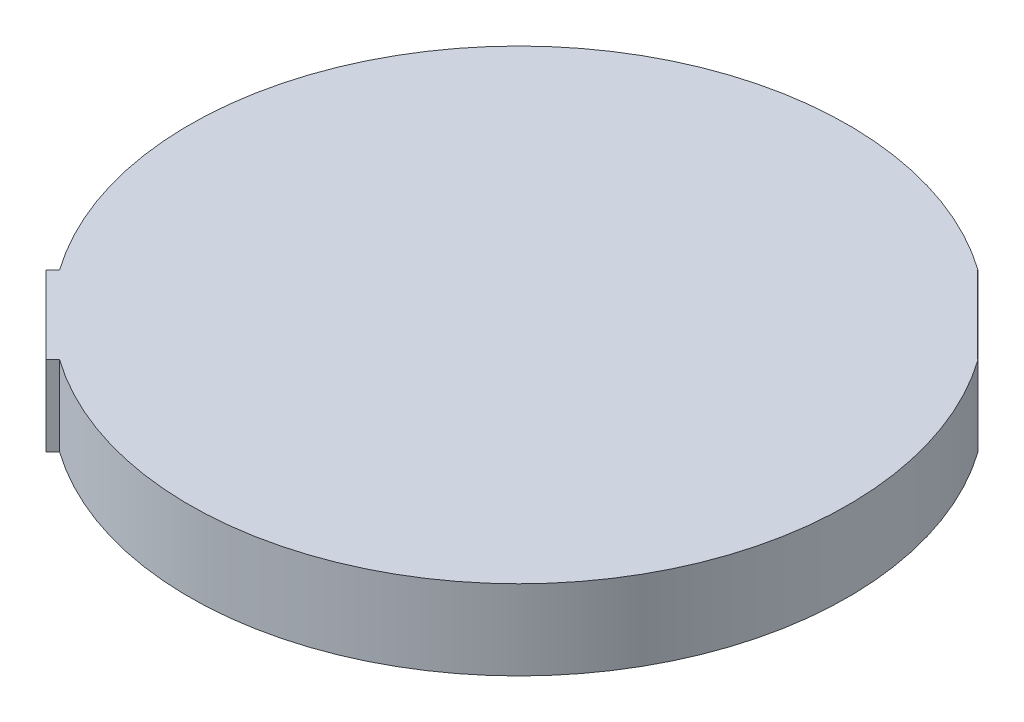
ISO-10303-21;
HEADER;
FILE_DESCRIPTION(('STEP AP214'),'2;1');
FILE_NAME('part.step','',(''),(''),'','','');
FILE_SCHEMA(('AUTOMOTIVE_DESIGN { 1 0 10303 214 1 1 1 1 }'));
ENDSEC;
DATA;
#1=APPLICATION_CONTEXT('core data for automotive mechanical design processes');
#2=APPLICATION_PROTOCOL_DEFINITION('international standard','automotive_design',2000,#1);
#3=PRODUCT_CONTEXT('',#1,'mechanical');
#4=PRODUCT('Part','Part','',(#3));
#5=PRODUCT_RELATED_PRODUCT_CATEGORY('part','',(#4));
#6=PRODUCT_DEFINITION_FORMATION('','',#4);
#7=PRODUCT_DEFINITION_CONTEXT('part definition',#1,'design');
#8=PRODUCT_DEFINITION('design','',#6,#7);
#9=PRODUCT_DEFINITION_SHAPE('','',#8);
#10=(LENGTH_UNIT() NAMED_UNIT(*) SI_UNIT(.MILLI.,.METRE.));
#11=(NAMED_UNIT(*) PLANE_ANGLE_UNIT() SI_UNIT($,.RADIAN.));
#12=(NAMED_UNIT(*) SI_UNIT($,.STERADIAN.) SOLID_ANGLE_UNIT());
#13=UNCERTAINTY_MEASURE_WITH_UNIT(LENGTH_MEASURE(1.E-05),#10,'distance_accuracy_value','');
#14=(GEOMETRIC_REPRESENTATION_CONTEXT(3) GLOBAL_UNCERTAINTY_ASSIGNED_CONTEXT((#13)) GLOBAL_UNIT_ASSIGNED_CONTEXT((#10,
#11,#12)) REPRESENTATION_CONTEXT('',''));
#15=CARTESIAN_POINT('',(0.,0.,0.));
#16=DIRECTION('',(0.,0.,1.));
#17=DIRECTION('',(1.,0.,0.));
#18=AXIS2_PLACEMENT_3D('',#15,#16,#17);
#19=CARTESIAN_POINT('',(0.,80.,0.));
#20=DIRECTION('',(0.,-1.,0.));
#21=DIRECTION('',(0.,0.,-1.));
#22=AXIS2_PLACEMENT_3D('',#19,#20,#21);
#23=CYLINDRICAL_SURFACE('',#22,330.);
#24=CARTESIAN_POINT('',(0.,80.,0.));
#25=DIRECTION('',(0.,1.,0.));
#26=DIRECTION('',(0.,0.,1.));
#27=AXIS2_PLACEMENT_3D('',#24,#25,#26);
#28=CIRCLE('',#27,330.);
#29=CARTESIAN_POINT('',(191.19063433161,80.,-268.972380262131));
#30=VERTEX_POINT('',#29);
#31=CARTESIAN_POINT('',(-268.972380262131,80.0000000000004,191.190634331611));
#32=VERTEX_POINT('',#31);
#33=EDGE_CURVE('E131',#30,#32,#28,.T.);
#34=ORIENTED_EDGE('',*,*,#33,.F.);
#35=DIRECTION('',(0.,-1.,0.));
#36=VECTOR('',#35,1.);
#37=CARTESIAN_POINT('',(191.19063433161,80.,-268.972380262131));
#38=LINE('',#37,#36);
#39=CARTESIAN_POINT('',(191.19063433161,0.,-268.972380262131));
#40=VERTEX_POINT('',#39);
#41=EDGE_CURVE('E154',#30,#40,#38,.T.);
#42=ORIENTED_EDGE('',*,*,#41,.T.);
#43=CARTESIAN_POINT('',(0.,0.,0.));
#44=DIRECTION('',(0.,1.,0.));
#45=DIRECTION('',(0.,0.,1.));
#46=AXIS2_PLACEMENT_3D('',#43,#44,#45);
#47=CIRCLE('',#46,330.);
#48=CARTESIAN_POINT('',(-268.972380262131,1.66533453693773E-13,191.190634331611));
#49=VERTEX_POINT('',#48);
#50=EDGE_CURVE('E122',#40,#49,#47,.T.);
#51=ORIENTED_EDGE('',*,*,#50,.T.);
#52=DIRECTION('',(0.,1.,0.));
#53=VECTOR('',#52,1.);
#54=CARTESIAN_POINT('',(-268.972380262131,-119.615611929521,191.190634331611));
#55=LINE('',#54,#53);
#56=EDGE_CURVE('E144',#49,#32,#55,.T.);
#57=ORIENTED_EDGE('',*,*,#56,.T.);
#58=EDGE_LOOP('',(#34,#42,#51,#57));
#59=FACE_BOUND('',#58,.T.);
#60=ADVANCED_FACE('F38',(#59),#23,.T.);
#61=CARTESIAN_POINT('',(-191.190634331611,2.77555756156289E-13,268.972380262131));
#62=VERTEX_POINT('',#61);
#63=CARTESIAN_POINT('',(268.972380262131,1.11022302462516E-13,-191.190634331611));
#64=VERTEX_POINT('',#63);
#65=EDGE_CURVE('E128',#62,#64,#47,.T.);
#66=ORIENTED_EDGE('',*,*,#65,.T.);
#67=DIRECTION('',(0.,-1.,0.));
#68=VECTOR('',#67,1.);
#69=CARTESIAN_POINT('',(268.972380262131,80.,-191.190634331611));
#70=LINE('',#69,#68);
#71=CARTESIAN_POINT('',(268.972380262131,80.0000000000001,-191.190634331611));
#72=VERTEX_POINT('',#71);
#73=EDGE_CURVE('E158',#64,#72,#70,.F.);
#74=ORIENTED_EDGE('',*,*,#73,.T.);
#75=CARTESIAN_POINT('',(-191.190634331611,80.0000000000002,268.972380262131));
#76=VERTEX_POINT('',#75);
#77=EDGE_CURVE('E61',#76,#72,#28,.T.);
#78=ORIENTED_EDGE('',*,*,#77,.F.);
#79=DIRECTION('',(0.,1.,0.));
#80=VECTOR('',#79,1.);
#81=CARTESIAN_POINT('',(-191.190634331611,-119.615611929521,268.972380262131));
#82=LINE('',#81,#80);
#83=EDGE_CURVE('E147',#62,#76,#82,.T.);
#84=ORIENTED_EDGE('',*,*,#83,.F.);
#85=EDGE_LOOP('',(#66,#74,#78,#84));
#86=FACE_BOUND('',#85,.T.);
#87=ADVANCED_FACE('F40',(#86),#23,.T.);
#88=CARTESIAN_POINT('',(0.,80.,0.));
#89=DIRECTION('',(0.,1.,0.));
#90=DIRECTION('',(0.,0.,1.));
#91=AXIS2_PLACEMENT_3D('',#88,#89,#90);
#92=PLANE('',#91);
#93=DIRECTION('',(-0.707106781186547,0.,0.707106781186548));
#94=VECTOR('',#93,1.);
#95=CARTESIAN_POINT('',(199.404112294606,80.0000000000004,-277.185858225127));
#96=LINE('',#95,#94);
#97=CARTESIAN_POINT('',(190.918830920368,80.,-268.700576850889));
#98=VERTEX_POINT('',#97);
#99=EDGE_CURVE('E116',#30,#98,#96,.T.);
#100=ORIENTED_EDGE('',*,*,#99,.F.);
#101=ORIENTED_EDGE('',*,*,#33,.T.);
#102=DIRECTION('',(-0.707106781186543,0.,0.707106781186554));
#103=VECTOR('',#102,1.);
#104=CARTESIAN_POINT('',(-272.236110756822,80.0000000000001,194.454364826301));
#105=LINE('',#104,#103);
#106=CARTESIAN_POINT('',(-275.771644662754,80.0000000000003,197.989898732234));
#107=VERTEX_POINT('',#106);
#108=EDGE_CURVE('E143',#32,#107,#105,.T.);
#109=ORIENTED_EDGE('',*,*,#108,.T.);
#110=DIRECTION('',(0.707106781186548,0.,0.707106781186549));
#111=VECTOR('',#110,1.);
#112=CARTESIAN_POINT('',(-275.771644662754,80.0000000000003,197.989898732234));
#113=LINE('',#112,#111);
#114=CARTESIAN_POINT('',(-197.989898732234,80.0000000000001,275.771644662753));
#115=VERTEX_POINT('',#114);
#116=EDGE_CURVE('E153',#107,#115,#113,.T.);
#117=ORIENTED_EDGE('',*,*,#116,.T.);
#118=DIRECTION('',(0.707106781186545,0.,-0.707106781186551));
#119=VECTOR('',#118,1.);
#120=CARTESIAN_POINT('',(-194.454364826301,80.,272.23611075682));
#121=LINE('',#120,#119);
#122=EDGE_CURVE('E156',#115,#76,#121,.T.);
#123=ORIENTED_EDGE('',*,*,#122,.T.);
#124=ORIENTED_EDGE('',*,*,#77,.T.);
#125=DIRECTION('',(-0.707106781186547,0.,0.707106781186548));
#126=VECTOR('',#125,1.);
#127=CARTESIAN_POINT('',(277.185858225127,80.0000000000003,-199.404112294607));
#128=LINE('',#127,#126);
#129=CARTESIAN_POINT('',(268.700576850888,79.9999999999997,-190.918830920368));
#130=VERTEX_POINT('',#129);
#131=EDGE_CURVE('E177',#72,#130,#128,.T.);
#132=ORIENTED_EDGE('',*,*,#131,.T.);
#133=DIRECTION('',(-0.707106781186548,0.,-0.707106781186549));
#134=VECTOR('',#133,1.);
#135=CARTESIAN_POINT('',(268.700576850888,79.9999999999997,-190.918830920368));
#136=LINE('',#135,#134);
#137=EDGE_CURVE('E179',#130,#98,#136,.T.);
#138=ORIENTED_EDGE('',*,*,#137,.T.);
#139=EDGE_LOOP('',(#100,#101,#109,#117,#123,#124,#132,#138));
#140=FACE_BOUND('',#139,.T.);
#141=ADVANCED_FACE('F140',(#140),#92,.T.);
#142=CARTESIAN_POINT('',(0.,0.,0.));
#143=DIRECTION('',(0.,1.,0.));
#144=DIRECTION('',(0.,0.,1.));
#145=AXIS2_PLACEMENT_3D('',#142,#143,#144);
#146=PLANE('',#145);
#147=ORIENTED_EDGE('',*,*,#50,.F.);
#148=DIRECTION('',(-0.707106781186548,0.,0.707106781186548));
#149=VECTOR('',#148,1.);
#150=CARTESIAN_POINT('',(-38.8908729652608,0.,-38.8908729652604));
#151=LINE('',#150,#149);
#152=CARTESIAN_POINT('',(190.918830920367,3.33066907387547E-13,-268.700576850889));
#153=VERTEX_POINT('',#152);
#154=EDGE_CURVE('E11',#40,#153,#151,.T.);
#155=ORIENTED_EDGE('',*,*,#154,.T.);
#156=DIRECTION('',(0.707106781186548,0.,0.707106781186549));
#157=VECTOR('',#156,1.);
#158=CARTESIAN_POINT('',(190.918830920367,3.33066907387547E-13,-268.700576850889));
#159=LINE('',#158,#157);
#160=CARTESIAN_POINT('',(268.700576850888,0.,-190.918830920368));
#161=VERTEX_POINT('',#160);
#162=EDGE_CURVE('E104',#153,#161,#159,.T.);
#163=ORIENTED_EDGE('',*,*,#162,.T.);
#164=DIRECTION('',(0.707106781186548,0.,-0.707106781186548));
#165=VECTOR('',#164,1.);
#166=CARTESIAN_POINT('',(38.8908729652597,0.,38.8908729652598));
#167=LINE('',#166,#165);
#168=EDGE_CURVE('E46',#161,#64,#167,.T.);
#169=ORIENTED_EDGE('',*,*,#168,.T.);
#170=ORIENTED_EDGE('',*,*,#65,.F.);
#171=DIRECTION('',(-0.707106781186545,0.,0.707106781186551));
#172=VECTOR('',#171,1.);
#173=CARTESIAN_POINT('',(-194.454364826301,0.,272.23611075682));
#174=LINE('',#173,#172);
#175=CARTESIAN_POINT('',(-197.989898732234,0.,275.771644662753));
#176=VERTEX_POINT('',#175);
#177=EDGE_CURVE('E132',#62,#176,#174,.T.);
#178=ORIENTED_EDGE('',*,*,#177,.T.);
#179=DIRECTION('',(-0.707106781186548,0.,-0.707106781186549));
#180=VECTOR('',#179,1.);
#181=CARTESIAN_POINT('',(-275.771644662754,1.11022302462516E-13,197.989898732233));
#182=LINE('',#181,#180);
#183=CARTESIAN_POINT('',(-275.771644662754,1.11022302462516E-13,197.989898732233));
#184=VERTEX_POINT('',#183);
#185=EDGE_CURVE('E146',#176,#184,#182,.T.);
#186=ORIENTED_EDGE('',*,*,#185,.T.);
#187=DIRECTION('',(0.707106781186543,0.,-0.707106781186554));
#188=VECTOR('',#187,1.);
#189=CARTESIAN_POINT('',(-272.236110756821,0.,194.454364826301));
#190=LINE('',#189,#188);
#191=EDGE_CURVE('E124',#184,#49,#190,.T.);
#192=ORIENTED_EDGE('',*,*,#191,.T.);
#193=EDGE_LOOP('',(#147,#155,#163,#169,#170,#178,#186,#192));
#194=FACE_BOUND('',#193,.T.);
#195=ADVANCED_FACE('F120',(#194),#146,.F.);
#196=CARTESIAN_POINT('',(-194.454364826301,-119.615611929521,272.236110756821));
#197=DIRECTION('',(0.707106781186551,0.,0.707106781186546));
#198=DIRECTION('',(0.707106781186545,0.,-0.707106781186551));
#199=AXIS2_PLACEMENT_3D('',#196,#197,#198);
#200=PLANE('',#199);
#201=ORIENTED_EDGE('',*,*,#177,.F.);
#202=ORIENTED_EDGE('',*,*,#83,.T.);
#203=ORIENTED_EDGE('',*,*,#122,.F.);
#204=DIRECTION('',(0.,1.,0.));
#205=VECTOR('',#204,1.);
#206=CARTESIAN_POINT('',(-197.989898732234,-119.615611929521,275.771644662753));
#207=LINE('',#206,#205);
#208=EDGE_CURVE('E165',#176,#115,#207,.T.);
#209=ORIENTED_EDGE('',*,*,#208,.F.);
#210=EDGE_LOOP('',(#201,#202,#203,#209));
#211=FACE_BOUND('',#210,.T.);
#212=ADVANCED_FACE('F174',(#211),#200,.T.);
#213=CARTESIAN_POINT('',(-275.771644662754,-119.615611929521,197.989898732233));
#214=DIRECTION('',(-0.707106781186547,0.,0.707106781186548));
#215=DIRECTION('',(0.707106781186548,0.,0.707106781186549));
#216=AXIS2_PLACEMENT_3D('',#213,#214,#215);
#217=PLANE('',#216);
#218=ORIENTED_EDGE('',*,*,#185,.F.);
#219=ORIENTED_EDGE('',*,*,#208,.T.);
#220=ORIENTED_EDGE('',*,*,#116,.F.);
#221=DIRECTION('',(0.,1.,0.));
#222=VECTOR('',#221,1.);
#223=CARTESIAN_POINT('',(-275.771644662754,-119.615611929521,197.989898732233));
#224=LINE('',#223,#222);
#225=EDGE_CURVE('E151',#184,#107,#224,.T.);
#226=ORIENTED_EDGE('',*,*,#225,.F.);
#227=EDGE_LOOP('',(#218,#219,#220,#226));
#228=FACE_BOUND('',#227,.T.);
#229=ADVANCED_FACE('F171',(#228),#217,.T.);
#230=CARTESIAN_POINT('',(-272.236110756821,-119.615611929521,194.4543648263));
#231=DIRECTION('',(-0.707106781186554,0.,-0.707106781186543));
#232=DIRECTION('',(-0.707106781186543,0.,0.707106781186554));
#233=AXIS2_PLACEMENT_3D('',#230,#231,#232);
#234=PLANE('',#233);
#235=ORIENTED_EDGE('',*,*,#191,.F.);
#236=ORIENTED_EDGE('',*,*,#225,.T.);
#237=ORIENTED_EDGE('',*,*,#108,.F.);
#238=ORIENTED_EDGE('',*,*,#56,.F.);
#239=EDGE_LOOP('',(#235,#236,#237,#238));
#240=FACE_BOUND('',#239,.T.);
#241=ADVANCED_FACE('F149',(#240),#234,.T.);
#242=CARTESIAN_POINT('',(199.404112294606,80.0000000000004,-277.185858225127));
#243=DIRECTION('',(-0.707106781186548,0.,-0.707106781186549));
#244=DIRECTION('',(-0.707106781186548,0.,0.707106781186548));
#245=AXIS2_PLACEMENT_3D('',#242,#243,#244);
#246=PLANE('',#245);
#247=ORIENTED_EDGE('',*,*,#99,.T.);
#248=DIRECTION('',(0.,-1.,0.));
#249=VECTOR('',#248,1.);
#250=CARTESIAN_POINT('',(190.918830920368,80.,-268.700576850889));
#251=LINE('',#250,#249);
#252=EDGE_CURVE('E107',#98,#153,#251,.T.);
#253=ORIENTED_EDGE('',*,*,#252,.T.);
#254=ORIENTED_EDGE('',*,*,#154,.F.);
#255=ORIENTED_EDGE('',*,*,#41,.F.);
#256=EDGE_LOOP('',(#247,#253,#254,#255));
#257=FACE_BOUND('',#256,.T.);
#258=ADVANCED_FACE('F113',(#257),#246,.F.);
#259=CARTESIAN_POINT('',(277.185858225126,0.,-199.404112294607));
#260=DIRECTION('',(0.707106781186548,0.,0.707106781186549));
#261=DIRECTION('',(0.707106781186548,0.,-0.707106781186548));
#262=AXIS2_PLACEMENT_3D('',#259,#260,#261);
#263=PLANE('',#262);
#264=ORIENTED_EDGE('',*,*,#168,.F.);
#265=DIRECTION('',(0.,1.,0.));
#266=VECTOR('',#265,1.);
#267=CARTESIAN_POINT('',(268.700576850888,0.,-190.918830920368));
#268=LINE('',#267,#266);
#269=EDGE_CURVE('E53',#161,#130,#268,.T.);
#270=ORIENTED_EDGE('',*,*,#269,.T.);
#271=ORIENTED_EDGE('',*,*,#131,.F.);
#272=ORIENTED_EDGE('',*,*,#73,.F.);
#273=EDGE_LOOP('',(#264,#270,#271,#272));
#274=FACE_BOUND('',#273,.T.);
#275=ADVANCED_FACE('F198',(#274),#263,.F.);
#276=CARTESIAN_POINT('',(229.809703885628,0.,-229.809703885628));
#277=DIRECTION('',(-0.707106781186548,0.,0.707106781186548));
#278=DIRECTION('',(0.707106781186548,0.,0.707106781186549));
#279=AXIS2_PLACEMENT_3D('',#276,#277,#278);
#280=PLANE('',#279);
#281=CARTESIAN_POINT('',(229.809703885628,40.0000000000003,-229.809703885628));
#282=DIRECTION('',(0.707106781186548,0.,-0.707106781186548));
#283=DIRECTION('',(-0.707106781186548,0.,-0.707106781186549));
#284=AXIS2_PLACEMENT_3D('',#281,#282,#283);
#285=CIRCLE('',#284,31.);
#286=CARTESIAN_POINT('',(207.889393668845,40.0000000000003,-251.730014102411));
#287=VERTEX_POINT('',#286);
#288=EDGE_CURVE('E183',#287,#287,#285,.T.);
#289=ORIENTED_EDGE('',*,*,#288,.F.);
#290=EDGE_LOOP('',(#289));
#291=FACE_BOUND('',#290,.T.);
#292=ORIENTED_EDGE('',*,*,#252,.F.);
#293=ORIENTED_EDGE('',*,*,#137,.F.);
#294=ORIENTED_EDGE('',*,*,#269,.F.);
#295=ORIENTED_EDGE('',*,*,#162,.F.);
#296=EDGE_LOOP('',(#292,#293,#294,#295));
#297=FACE_BOUND('',#296,.T.);
#298=ADVANCED_FACE('F106',(#291,#297),#280,.F.);
#299=CARTESIAN_POINT('',(220.617315730203,40.,-220.617315730203));
#300=DIRECTION('',(0.707106781186548,0.,-0.707106781186548));
#301=DIRECTION('',(-0.707106781186548,0.,-0.707106781186549));
#302=AXIS2_PLACEMENT_3D('',#299,#300,#301);
#303=CYLINDRICAL_SURFACE('',#302,31.);
#304=CARTESIAN_POINT('',(220.617315730203,40.,-220.617315730203));
#305=DIRECTION('',(0.707106781186548,0.,-0.707106781186548));
#306=DIRECTION('',(-0.707106781186548,0.,-0.707106781186549));
#307=AXIS2_PLACEMENT_3D('',#304,#305,#306);
#308=CIRCLE('',#307,31.);
#309=CARTESIAN_POINT('',(198.69700551342,40.,-242.537625946986));
#310=VERTEX_POINT('',#309);
#311=EDGE_CURVE('E117',#310,#310,#308,.T.);
#312=ORIENTED_EDGE('',*,*,#311,.F.);
#313=EDGE_LOOP('',(#312));
#314=FACE_BOUND('',#313,.T.);
#315=ORIENTED_EDGE('',*,*,#288,.T.);
#316=EDGE_LOOP('',(#315));
#317=FACE_BOUND('',#316,.T.);
#318=ADVANCED_FACE('F191',(#314,#317),#303,.F.);
#319=CARTESIAN_POINT('',(220.617315730203,40.,-220.617315730203));
#320=DIRECTION('',(0.707106781186548,0.,-0.707106781186548));
#321=DIRECTION('',(-0.707106781186548,0.,-0.707106781186549));
#322=AXIS2_PLACEMENT_3D('',#319,#320,#321);
#323=PLANE('',#322);
#324=ORIENTED_EDGE('',*,*,#311,.T.);
#325=EDGE_LOOP('',(#324));
#326=FACE_BOUND('',#325,.T.);
#327=ADVANCED_FACE('F189',(#326),#323,.T.);
#328=CLOSED_SHELL('',(#60,#87,#141,#195,#212,#229,#241,#258,#275,#298,#318,#327));
#329=MANIFOLD_SOLID_BREP('B2',#328);
#330=ADVANCED_BREP_SHAPE_REPRESENTATION('',(#18,#329),#14);
#331=SHAPE_DEFINITION_REPRESENTATION(#9,#330);
ENDSEC;
END-ISO-10303-21;
